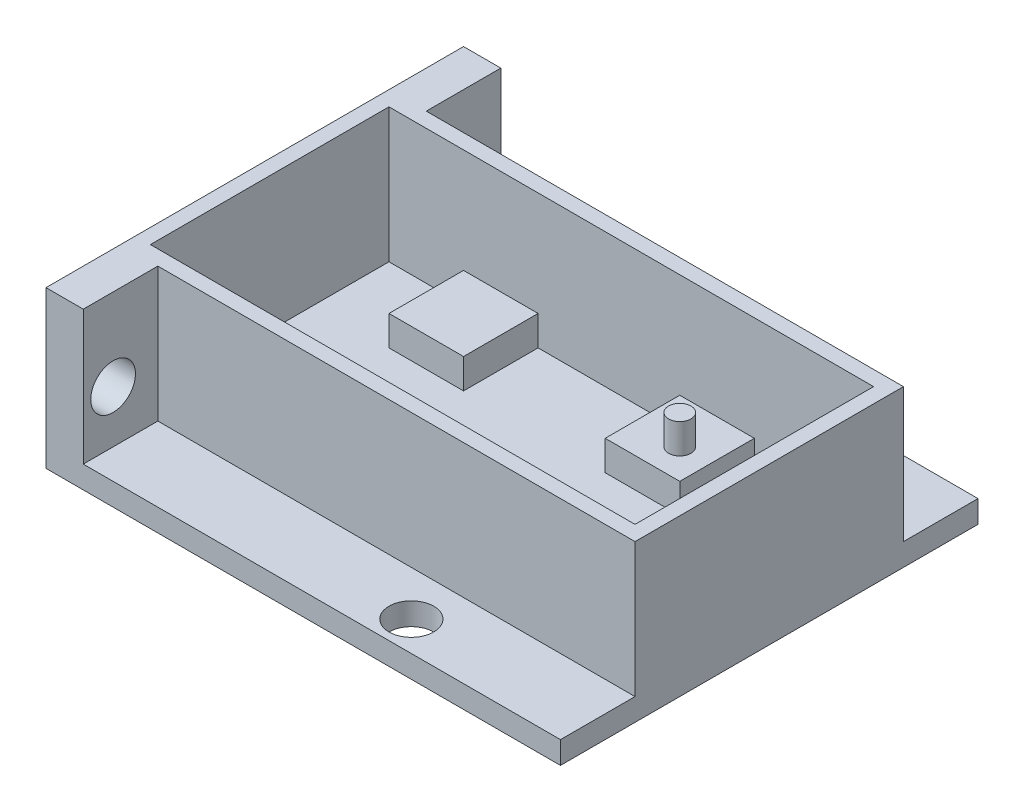
ISO-10303-21;
HEADER;
FILE_DESCRIPTION(('STEP AP214'),'2;1');
FILE_NAME('part.step','',(''),(''),'','','');
FILE_SCHEMA(('AUTOMOTIVE_DESIGN { 1 0 10303 214 1 1 1 1 }'));
ENDSEC;
DATA;
#1=APPLICATION_CONTEXT('core data for automotive mechanical design processes');
#2=APPLICATION_PROTOCOL_DEFINITION('international standard','automotive_design',2000,#1);
#3=PRODUCT_CONTEXT('',#1,'mechanical');
#4=PRODUCT('Part','Part','',(#3));
#5=PRODUCT_RELATED_PRODUCT_CATEGORY('part','',(#4));
#6=PRODUCT_DEFINITION_FORMATION('','',#4);
#7=PRODUCT_DEFINITION_CONTEXT('part definition',#1,'design');
#8=PRODUCT_DEFINITION('design','',#6,#7);
#9=PRODUCT_DEFINITION_SHAPE('','',#8);
#10=(LENGTH_UNIT() NAMED_UNIT(*) SI_UNIT(.MILLI.,.METRE.));
#11=(NAMED_UNIT(*) PLANE_ANGLE_UNIT() SI_UNIT($,.RADIAN.));
#12=(NAMED_UNIT(*) SI_UNIT($,.STERADIAN.) SOLID_ANGLE_UNIT());
#13=UNCERTAINTY_MEASURE_WITH_UNIT(LENGTH_MEASURE(1.E-05),#10,'distance_accuracy_value','');
#14=(GEOMETRIC_REPRESENTATION_CONTEXT(3) GLOBAL_UNCERTAINTY_ASSIGNED_CONTEXT((#13)) GLOBAL_UNIT_ASSIGNED_CONTEXT((#10,
#11,#12)) REPRESENTATION_CONTEXT('',''));
#15=CARTESIAN_POINT('',(0.,0.,0.));
#16=DIRECTION('',(0.,0.,1.));
#17=DIRECTION('',(1.,0.,0.));
#18=AXIS2_PLACEMENT_3D('',#15,#16,#17);
#19=CARTESIAN_POINT('',(-17.25,10.5,9.));
#20=DIRECTION('',(0.,0.,-1.));
#21=DIRECTION('',(-1.,0.,0.));
#22=AXIS2_PLACEMENT_3D('',#19,#20,#21);
#23=PLANE('',#22);
#24=DIRECTION('',(0.,-1.,0.));
#25=VECTOR('',#24,1.);
#26=CARTESIAN_POINT('',(-14.75,16.0901699437495,9.));
#27=LINE('',#26,#25);
#28=CARTESIAN_POINT('',(-14.75,10.5,9.));
#29=VERTEX_POINT('',#28);
#30=CARTESIAN_POINT('',(-14.75,1.5,9.));
#31=VERTEX_POINT('',#30);
#32=EDGE_CURVE('E234',#29,#31,#27,.T.);
#33=ORIENTED_EDGE('',*,*,#32,.T.);
#34=DIRECTION('',(-1.,0.,0.));
#35=VECTOR('',#34,1.);
#36=CARTESIAN_POINT('',(-17.25,1.5,9.));
#37=LINE('',#36,#35);
#38=CARTESIAN_POINT('',(17.25,1.5,9.));
#39=VERTEX_POINT('',#38);
#40=EDGE_CURVE('E458',#39,#31,#37,.T.);
#41=ORIENTED_EDGE('',*,*,#40,.F.);
#42=DIRECTION('',(0.,-1.,0.));
#43=VECTOR('',#42,1.);
#44=CARTESIAN_POINT('',(17.25,10.5,9.));
#45=LINE('',#44,#43);
#46=CARTESIAN_POINT('',(17.25,10.5,9.));
#47=VERTEX_POINT('',#46);
#48=EDGE_CURVE('E253',#47,#39,#45,.T.);
#49=ORIENTED_EDGE('',*,*,#48,.F.);
#50=DIRECTION('',(1.,0.,0.));
#51=VECTOR('',#50,1.);
#52=CARTESIAN_POINT('',(-17.25,10.5,9.));
#53=LINE('',#52,#51);
#54=EDGE_CURVE('E248',#29,#47,#53,.T.);
#55=ORIENTED_EDGE('',*,*,#54,.F.);
#56=EDGE_LOOP('',(#33,#41,#49,#55));
#57=FACE_BOUND('',#56,.T.);
#58=ADVANCED_FACE('F37',(#57),#23,.F.);
#59=CARTESIAN_POINT('',(0.,1.5,0.));
#60=DIRECTION('',(0.,1.,0.));
#61=DIRECTION('',(0.,0.,1.));
#62=AXIS2_PLACEMENT_3D('',#59,#60,#61);
#63=PLANE('',#62);
#64=CARTESIAN_POINT('',(5.25,1.5,12.));
#65=DIRECTION('',(0.,1.,0.));
#66=DIRECTION('',(0.,0.,-1.));
#67=AXIS2_PLACEMENT_3D('',#64,#65,#66);
#68=CIRCLE('',#67,1.5);
#69=CARTESIAN_POINT('',(5.25,1.5,10.5));
#70=VERTEX_POINT('',#69);
#71=EDGE_CURVE('E469',#70,#70,#68,.T.);
#72=ORIENTED_EDGE('',*,*,#71,.F.);
#73=EDGE_LOOP('',(#72));
#74=FACE_BOUND('',#73,.T.);
#75=ORIENTED_EDGE('',*,*,#40,.T.);
#76=DIRECTION('',(0.,0.,-1.));
#77=VECTOR('',#76,1.);
#78=CARTESIAN_POINT('',(-14.75,1.5,14.));
#79=LINE('',#78,#77);
#80=CARTESIAN_POINT('',(-14.75,1.5,14.));
#81=VERTEX_POINT('',#80);
#82=EDGE_CURVE('E238',#81,#31,#79,.T.);
#83=ORIENTED_EDGE('',*,*,#82,.F.);
#84=DIRECTION('',(1.,0.,0.));
#85=VECTOR('',#84,1.);
#86=CARTESIAN_POINT('',(-17.25,1.5,14.));
#87=LINE('',#86,#85);
#88=CARTESIAN_POINT('',(17.25,1.5,14.));
#89=VERTEX_POINT('',#88);
#90=EDGE_CURVE('E462',#81,#89,#87,.T.);
#91=ORIENTED_EDGE('',*,*,#90,.T.);
#92=DIRECTION('',(0.,0.,-1.));
#93=VECTOR('',#92,1.);
#94=CARTESIAN_POINT('',(17.25,1.5,9.));
#95=LINE('',#94,#93);
#96=EDGE_CURVE('E465',#89,#39,#95,.T.);
#97=ORIENTED_EDGE('',*,*,#96,.T.);
#98=EDGE_LOOP('',(#75,#83,#91,#97));
#99=FACE_BOUND('',#98,.T.);
#100=ADVANCED_FACE('F578',(#74,#99),#63,.T.);
#101=CARTESIAN_POINT('',(-17.25,10.5,-9.));
#102=DIRECTION('',(0.,0.,1.));
#103=DIRECTION('',(1.,0.,0.));
#104=AXIS2_PLACEMENT_3D('',#101,#102,#103);
#105=PLANE('',#104);
#106=DIRECTION('',(0.,-1.,0.));
#107=VECTOR('',#106,1.);
#108=CARTESIAN_POINT('',(-14.75,16.0901699437495,-9.));
#109=LINE('',#108,#107);
#110=CARTESIAN_POINT('',(-14.75,10.5,-9.));
#111=VERTEX_POINT('',#110);
#112=CARTESIAN_POINT('',(-14.75,1.5,-9.));
#113=VERTEX_POINT('',#112);
#114=EDGE_CURVE('E60',#111,#113,#109,.T.);
#115=ORIENTED_EDGE('',*,*,#114,.F.);
#116=DIRECTION('',(-1.,0.,0.));
#117=VECTOR('',#116,1.);
#118=CARTESIAN_POINT('',(-17.25,10.5,-9.));
#119=LINE('',#118,#117);
#120=CARTESIAN_POINT('',(17.25,10.5,-9.));
#121=VERTEX_POINT('',#120);
#122=EDGE_CURVE('E258',#121,#111,#119,.T.);
#123=ORIENTED_EDGE('',*,*,#122,.F.);
#124=DIRECTION('',(0.,-1.,0.));
#125=VECTOR('',#124,1.);
#126=CARTESIAN_POINT('',(17.25,10.5,-9.));
#127=LINE('',#126,#125);
#128=CARTESIAN_POINT('',(17.25,1.5,-9.));
#129=VERTEX_POINT('',#128);
#130=EDGE_CURVE('E265',#121,#129,#127,.T.);
#131=ORIENTED_EDGE('',*,*,#130,.T.);
#132=DIRECTION('',(1.,0.,0.));
#133=VECTOR('',#132,1.);
#134=CARTESIAN_POINT('',(-17.25,1.5,-9.));
#135=LINE('',#134,#133);
#136=EDGE_CURVE('E447',#113,#129,#135,.T.);
#137=ORIENTED_EDGE('',*,*,#136,.F.);
#138=EDGE_LOOP('',(#115,#123,#131,#137));
#139=FACE_BOUND('',#138,.T.);
#140=ADVANCED_FACE('F583',(#139),#105,.F.);
#141=CARTESIAN_POINT('',(0.,1.5,0.));
#142=DIRECTION('',(0.,-1.,0.));
#143=DIRECTION('',(0.,0.,-1.));
#144=AXIS2_PLACEMENT_3D('',#141,#142,#143);
#145=PLANE('',#144);
#146=CARTESIAN_POINT('',(5.25,1.5,-12.));
#147=DIRECTION('',(0.,1.,0.));
#148=DIRECTION('',(0.,0.,1.));
#149=AXIS2_PLACEMENT_3D('',#146,#147,#148);
#150=CIRCLE('',#149,1.5);
#151=CARTESIAN_POINT('',(5.25,1.5,-10.5));
#152=VERTEX_POINT('',#151);
#153=EDGE_CURVE('E476',#152,#152,#150,.T.);
#154=ORIENTED_EDGE('',*,*,#153,.F.);
#155=EDGE_LOOP('',(#154));
#156=FACE_BOUND('',#155,.T.);
#157=DIRECTION('',(0.,0.,-1.));
#158=VECTOR('',#157,1.);
#159=CARTESIAN_POINT('',(-14.75,1.5,-14.));
#160=LINE('',#159,#158);
#161=CARTESIAN_POINT('',(-14.75,1.5,-14.));
#162=VERTEX_POINT('',#161);
#163=EDGE_CURVE('E485',#113,#162,#160,.T.);
#164=ORIENTED_EDGE('',*,*,#163,.F.);
#165=ORIENTED_EDGE('',*,*,#136,.T.);
#166=DIRECTION('',(0.,0.,-1.));
#167=VECTOR('',#166,1.);
#168=CARTESIAN_POINT('',(17.25,1.5,-9.));
#169=LINE('',#168,#167);
#170=CARTESIAN_POINT('',(17.25,1.5,-14.));
#171=VERTEX_POINT('',#170);
#172=EDGE_CURVE('E450',#129,#171,#169,.T.);
#173=ORIENTED_EDGE('',*,*,#172,.T.);
#174=DIRECTION('',(-1.,0.,0.));
#175=VECTOR('',#174,1.);
#176=CARTESIAN_POINT('',(-17.25,1.5,-14.));
#177=LINE('',#176,#175);
#178=EDGE_CURVE('E443',#171,#162,#177,.T.);
#179=ORIENTED_EDGE('',*,*,#178,.T.);
#180=EDGE_LOOP('',(#164,#165,#173,#179));
#181=FACE_BOUND('',#180,.T.);
#182=ADVANCED_FACE('F594',(#156,#181),#145,.F.);
#183=CARTESIAN_POINT('',(0.,1.5,0.));
#184=DIRECTION('',(0.,1.,0.));
#185=DIRECTION('',(0.,0.,1.));
#186=AXIS2_PLACEMENT_3D('',#183,#184,#185);
#187=PLANE('',#186);
#188=DIRECTION('',(1.,0.,0.));
#189=VECTOR('',#188,1.);
#190=CARTESIAN_POINT('',(-16.25,1.5,8.));
#191=LINE('',#190,#189);
#192=CARTESIAN_POINT('',(-16.25,1.5,8.));
#193=VERTEX_POINT('',#192);
#194=CARTESIAN_POINT('',(-11.25,1.5,8.));
#195=VERTEX_POINT('',#194);
#196=EDGE_CURVE('E277',#193,#195,#191,.T.);
#197=ORIENTED_EDGE('',*,*,#196,.T.);
#198=DIRECTION('',(0.,0.,1.));
#199=VECTOR('',#198,1.);
#200=CARTESIAN_POINT('',(-11.25,1.5,8.));
#201=LINE('',#200,#199);
#202=CARTESIAN_POINT('',(-11.25,1.5,3.));
#203=VERTEX_POINT('',#202);
#204=EDGE_CURVE('E428',#203,#195,#201,.T.);
#205=ORIENTED_EDGE('',*,*,#204,.F.);
#206=DIRECTION('',(-1.,0.,0.));
#207=VECTOR('',#206,1.);
#208=CARTESIAN_POINT('',(-11.25,1.5,3.));
#209=LINE('',#208,#207);
#210=CARTESIAN_POINT('',(-6.25,1.5,3.));
#211=VERTEX_POINT('',#210);
#212=EDGE_CURVE('E423',#211,#203,#209,.T.);
#213=ORIENTED_EDGE('',*,*,#212,.F.);
#214=DIRECTION('',(0.,0.,-1.));
#215=VECTOR('',#214,1.);
#216=CARTESIAN_POINT('',(-6.25,1.5,8.));
#217=LINE('',#216,#215);
#218=CARTESIAN_POINT('',(-6.25,1.5,8.));
#219=VERTEX_POINT('',#218);
#220=EDGE_CURVE('E426',#219,#211,#217,.T.);
#221=ORIENTED_EDGE('',*,*,#220,.F.);
#222=CARTESIAN_POINT('',(3.25000000000001,1.5,8.));
#223=VERTEX_POINT('',#222);
#224=EDGE_CURVE('E281',#219,#223,#191,.T.);
#225=ORIENTED_EDGE('',*,*,#224,.T.);
#226=DIRECTION('',(0.,0.,1.));
#227=VECTOR('',#226,1.);
#228=CARTESIAN_POINT('',(3.25000000000001,1.5,8.));
#229=LINE('',#228,#227);
#230=CARTESIAN_POINT('',(3.25000000000001,1.5,3.));
#231=VERTEX_POINT('',#230);
#232=EDGE_CURVE('E364',#231,#223,#229,.T.);
#233=ORIENTED_EDGE('',*,*,#232,.F.);
#234=DIRECTION('',(-1.,0.,0.));
#235=VECTOR('',#234,1.);
#236=CARTESIAN_POINT('',(8.25000000000001,1.5,3.));
#237=LINE('',#236,#235);
#238=CARTESIAN_POINT('',(8.25000000000001,1.5,3.));
#239=VERTEX_POINT('',#238);
#240=EDGE_CURVE('E368',#239,#231,#237,.T.);
#241=ORIENTED_EDGE('',*,*,#240,.F.);
#242=DIRECTION('',(0.,0.,-1.));
#243=VECTOR('',#242,1.);
#244=CARTESIAN_POINT('',(8.25000000000001,1.5,8.));
#245=LINE('',#244,#243);
#246=CARTESIAN_POINT('',(8.25,1.5,8.));
#247=VERTEX_POINT('',#246);
#248=EDGE_CURVE('E371',#247,#239,#245,.T.);
#249=ORIENTED_EDGE('',*,*,#248,.F.);
#250=CARTESIAN_POINT('',(16.25,1.5,8.));
#251=VERTEX_POINT('',#250);
#252=EDGE_CURVE('E276',#247,#251,#191,.T.);
#253=ORIENTED_EDGE('',*,*,#252,.T.);
#254=DIRECTION('',(0.,0.,-1.));
#255=VECTOR('',#254,1.);
#256=CARTESIAN_POINT('',(16.25,1.5,-8.));
#257=LINE('',#256,#255);
#258=CARTESIAN_POINT('',(16.25,1.5,-8.));
#259=VERTEX_POINT('',#258);
#260=EDGE_CURVE('E280',#251,#259,#257,.T.);
#261=ORIENTED_EDGE('',*,*,#260,.T.);
#262=DIRECTION('',(-1.,0.,0.));
#263=VECTOR('',#262,1.);
#264=CARTESIAN_POINT('',(-16.25,1.5,-8.));
#265=LINE('',#264,#263);
#266=CARTESIAN_POINT('',(8.25,1.5,-8.));
#267=VERTEX_POINT('',#266);
#268=EDGE_CURVE('E45',#259,#267,#265,.T.);
#269=ORIENTED_EDGE('',*,*,#268,.T.);
#270=DIRECTION('',(0.,0.,-1.));
#271=VECTOR('',#270,1.);
#272=CARTESIAN_POINT('',(8.25,1.5,-8.));
#273=LINE('',#272,#271);
#274=CARTESIAN_POINT('',(8.25,1.5,-3.));
#275=VERTEX_POINT('',#274);
#276=EDGE_CURVE('E342',#275,#267,#273,.T.);
#277=ORIENTED_EDGE('',*,*,#276,.F.);
#278=DIRECTION('',(1.,0.,0.));
#279=VECTOR('',#278,1.);
#280=CARTESIAN_POINT('',(8.25,1.5,-3.));
#281=LINE('',#280,#279);
#282=CARTESIAN_POINT('',(3.25,1.5,-3.));
#283=VERTEX_POINT('',#282);
#284=EDGE_CURVE('E337',#283,#275,#281,.T.);
#285=ORIENTED_EDGE('',*,*,#284,.F.);
#286=DIRECTION('',(0.,0.,1.));
#287=VECTOR('',#286,1.);
#288=CARTESIAN_POINT('',(3.25,1.5,-8.));
#289=LINE('',#288,#287);
#290=CARTESIAN_POINT('',(3.25,1.5,-8.));
#291=VERTEX_POINT('',#290);
#292=EDGE_CURVE('E340',#291,#283,#289,.T.);
#293=ORIENTED_EDGE('',*,*,#292,.F.);
#294=CARTESIAN_POINT('',(-6.25,1.5,-8.));
#295=VERTEX_POINT('',#294);
#296=EDGE_CURVE('E285',#291,#295,#265,.T.);
#297=ORIENTED_EDGE('',*,*,#296,.T.);
#298=DIRECTION('',(0.,0.,-1.));
#299=VECTOR('',#298,1.);
#300=CARTESIAN_POINT('',(-6.25,1.5,-8.));
#301=LINE('',#300,#299);
#302=CARTESIAN_POINT('',(-6.25,1.5,-3.));
#303=VERTEX_POINT('',#302);
#304=EDGE_CURVE('E394',#303,#295,#301,.T.);
#305=ORIENTED_EDGE('',*,*,#304,.F.);
#306=DIRECTION('',(1.,0.,0.));
#307=VECTOR('',#306,1.);
#308=CARTESIAN_POINT('',(-11.25,1.5,-3.));
#309=LINE('',#308,#307);
#310=CARTESIAN_POINT('',(-11.25,1.5,-3.));
#311=VERTEX_POINT('',#310);
#312=EDGE_CURVE('E398',#311,#303,#309,.T.);
#313=ORIENTED_EDGE('',*,*,#312,.F.);
#314=DIRECTION('',(0.,0.,1.));
#315=VECTOR('',#314,1.);
#316=CARTESIAN_POINT('',(-11.25,1.5,-8.));
#317=LINE('',#316,#315);
#318=CARTESIAN_POINT('',(-11.25,1.5,-8.));
#319=VERTEX_POINT('',#318);
#320=EDGE_CURVE('E294',#319,#311,#317,.T.);
#321=ORIENTED_EDGE('',*,*,#320,.F.);
#322=CARTESIAN_POINT('',(-16.25,1.5,-8.));
#323=VERTEX_POINT('',#322);
#324=EDGE_CURVE('E283',#319,#323,#265,.T.);
#325=ORIENTED_EDGE('',*,*,#324,.T.);
#326=DIRECTION('',(0.,0.,1.));
#327=VECTOR('',#326,1.);
#328=CARTESIAN_POINT('',(-16.25,1.5,-8.));
#329=LINE('',#328,#327);
#330=EDGE_CURVE('E273',#323,#193,#329,.T.);
#331=ORIENTED_EDGE('',*,*,#330,.T.);
#332=EDGE_LOOP('',(#197,#205,#213,#221,#225,#233,#241,#249,#253,#261,#269,#277,#285,#293,#297,
#305,#313,#321,#325,#331));
#333=FACE_BOUND('',#332,.T.);
#334=ADVANCED_FACE('F291',(#333),#187,.T.);
#335=CARTESIAN_POINT('',(-16.25,10.5,8.));
#336=DIRECTION('',(0.,0.,-1.));
#337=DIRECTION('',(-1.,0.,0.));
#338=AXIS2_PLACEMENT_3D('',#335,#336,#337);
#339=PLANE('',#338);
#340=DIRECTION('',(1.,0.,0.));
#341=VECTOR('',#340,1.);
#342=CARTESIAN_POINT('',(-11.25,3.5,8.));
#343=LINE('',#342,#341);
#344=CARTESIAN_POINT('',(-11.25,3.5,8.));
#345=VERTEX_POINT('',#344);
#346=CARTESIAN_POINT('',(-6.25,3.5,8.));
#347=VERTEX_POINT('',#346);
#348=EDGE_CURVE('E434',#345,#347,#343,.T.);
#349=ORIENTED_EDGE('',*,*,#348,.F.);
#350=DIRECTION('',(0.,-1.,0.));
#351=VECTOR('',#350,1.);
#352=CARTESIAN_POINT('',(-11.25,3.5,8.));
#353=LINE('',#352,#351);
#354=EDGE_CURVE('E402',#345,#195,#353,.T.);
#355=ORIENTED_EDGE('',*,*,#354,.T.);
#356=ORIENTED_EDGE('',*,*,#196,.F.);
#357=DIRECTION('',(0.,-1.,0.));
#358=VECTOR('',#357,1.);
#359=CARTESIAN_POINT('',(-16.25,10.5,8.));
#360=LINE('',#359,#358);
#361=CARTESIAN_POINT('',(-16.25,10.5,8.));
#362=VERTEX_POINT('',#361);
#363=EDGE_CURVE('E268',#362,#193,#360,.T.);
#364=ORIENTED_EDGE('',*,*,#363,.F.);
#365=DIRECTION('',(1.,0.,0.));
#366=VECTOR('',#365,1.);
#367=CARTESIAN_POINT('',(-16.25,10.5,8.));
#368=LINE('',#367,#366);
#369=CARTESIAN_POINT('',(16.25,10.5,8.));
#370=VERTEX_POINT('',#369);
#371=EDGE_CURVE('E322',#362,#370,#368,.T.);
#372=ORIENTED_EDGE('',*,*,#371,.T.);
#373=DIRECTION('',(0.,-1.,0.));
#374=VECTOR('',#373,1.);
#375=CARTESIAN_POINT('',(16.25,10.5,8.));
#376=LINE('',#375,#374);
#377=EDGE_CURVE('E312',#370,#251,#376,.T.);
#378=ORIENTED_EDGE('',*,*,#377,.T.);
#379=ORIENTED_EDGE('',*,*,#252,.F.);
#380=DIRECTION('',(0.,-1.,0.));
#381=VECTOR('',#380,1.);
#382=CARTESIAN_POINT('',(8.25000000000001,3.5,8.));
#383=LINE('',#382,#381);
#384=CARTESIAN_POINT('',(8.25000000000001,3.5,8.));
#385=VERTEX_POINT('',#384);
#386=EDGE_CURVE('E360',#385,#247,#383,.T.);
#387=ORIENTED_EDGE('',*,*,#386,.F.);
#388=DIRECTION('',(1.,0.,0.));
#389=VECTOR('',#388,1.);
#390=CARTESIAN_POINT('',(8.25000000000001,3.5,8.));
#391=LINE('',#390,#389);
#392=CARTESIAN_POINT('',(3.25000000000001,3.5,8.));
#393=VERTEX_POINT('',#392);
#394=EDGE_CURVE('E363',#393,#385,#391,.T.);
#395=ORIENTED_EDGE('',*,*,#394,.F.);
#396=DIRECTION('',(0.,-1.,0.));
#397=VECTOR('',#396,1.);
#398=CARTESIAN_POINT('',(3.25000000000001,3.5,8.));
#399=LINE('',#398,#397);
#400=EDGE_CURVE('E357',#393,#223,#399,.T.);
#401=ORIENTED_EDGE('',*,*,#400,.T.);
#402=ORIENTED_EDGE('',*,*,#224,.F.);
#403=DIRECTION('',(0.,-1.,0.));
#404=VECTOR('',#403,1.);
#405=CARTESIAN_POINT('',(-6.25,3.5,8.));
#406=LINE('',#405,#404);
#407=EDGE_CURVE('E414',#347,#219,#406,.T.);
#408=ORIENTED_EDGE('',*,*,#407,.F.);
#409=EDGE_LOOP('',(#349,#355,#356,#364,#372,#378,#379,#387,#395,#401,#402,#408));
#410=FACE_BOUND('',#409,.T.);
#411=ADVANCED_FACE('F545',(#410),#339,.T.);
#412=CARTESIAN_POINT('',(-16.25,10.5,-8.));
#413=DIRECTION('',(0.,0.,1.));
#414=DIRECTION('',(1.,0.,0.));
#415=AXIS2_PLACEMENT_3D('',#412,#413,#414);
#416=PLANE('',#415);
#417=ORIENTED_EDGE('',*,*,#324,.F.);
#418=DIRECTION('',(0.,-1.,0.));
#419=VECTOR('',#418,1.);
#420=CARTESIAN_POINT('',(-11.25,3.5,-8.));
#421=LINE('',#420,#419);
#422=CARTESIAN_POINT('',(-11.25,3.5,-8.));
#423=VERTEX_POINT('',#422);
#424=EDGE_CURVE('E391',#423,#319,#421,.T.);
#425=ORIENTED_EDGE('',*,*,#424,.F.);
#426=DIRECTION('',(-1.,0.,0.));
#427=VECTOR('',#426,1.);
#428=CARTESIAN_POINT('',(-11.25,3.5,-8.));
#429=LINE('',#428,#427);
#430=CARTESIAN_POINT('',(-6.25,3.5,-8.));
#431=VERTEX_POINT('',#430);
#432=EDGE_CURVE('E393',#431,#423,#429,.T.);
#433=ORIENTED_EDGE('',*,*,#432,.F.);
#434=DIRECTION('',(0.,-1.,0.));
#435=VECTOR('',#434,1.);
#436=CARTESIAN_POINT('',(-6.25,3.5,-8.));
#437=LINE('',#436,#435);
#438=EDGE_CURVE('E389',#431,#295,#437,.T.);
#439=ORIENTED_EDGE('',*,*,#438,.T.);
#440=ORIENTED_EDGE('',*,*,#296,.F.);
#441=DIRECTION('',(0.,-1.,0.));
#442=VECTOR('',#441,1.);
#443=CARTESIAN_POINT('',(3.25,3.5,-8.));
#444=LINE('',#443,#442);
#445=CARTESIAN_POINT('',(3.25,3.5,-8.));
#446=VERTEX_POINT('',#445);
#447=EDGE_CURVE('E328',#446,#291,#444,.T.);
#448=ORIENTED_EDGE('',*,*,#447,.F.);
#449=DIRECTION('',(-1.,0.,0.));
#450=VECTOR('',#449,1.);
#451=CARTESIAN_POINT('',(8.25,3.5,-8.));
#452=LINE('',#451,#450);
#453=CARTESIAN_POINT('',(8.25,3.5,-8.));
#454=VERTEX_POINT('',#453);
#455=EDGE_CURVE('E348',#454,#446,#452,.T.);
#456=ORIENTED_EDGE('',*,*,#455,.F.);
#457=DIRECTION('',(0.,-1.,0.));
#458=VECTOR('',#457,1.);
#459=CARTESIAN_POINT('',(8.25,3.5,-8.));
#460=LINE('',#459,#458);
#461=EDGE_CURVE('E325',#454,#267,#460,.T.);
#462=ORIENTED_EDGE('',*,*,#461,.T.);
#463=ORIENTED_EDGE('',*,*,#268,.F.);
#464=DIRECTION('',(0.,-1.,0.));
#465=VECTOR('',#464,1.);
#466=CARTESIAN_POINT('',(16.25,10.5,-8.));
#467=LINE('',#466,#465);
#468=CARTESIAN_POINT('',(16.25,10.5,-8.));
#469=VERTEX_POINT('',#468);
#470=EDGE_CURVE('E304',#469,#259,#467,.T.);
#471=ORIENTED_EDGE('',*,*,#470,.F.);
#472=DIRECTION('',(-1.,0.,0.));
#473=VECTOR('',#472,1.);
#474=CARTESIAN_POINT('',(-16.25,10.5,-8.));
#475=LINE('',#474,#473);
#476=CARTESIAN_POINT('',(-16.25,10.5,-8.));
#477=VERTEX_POINT('',#476);
#478=EDGE_CURVE('E301',#469,#477,#475,.T.);
#479=ORIENTED_EDGE('',*,*,#478,.T.);
#480=DIRECTION('',(0.,-1.,0.));
#481=VECTOR('',#480,1.);
#482=CARTESIAN_POINT('',(-16.25,10.5,-8.));
#483=LINE('',#482,#481);
#484=EDGE_CURVE('E298',#477,#323,#483,.T.);
#485=ORIENTED_EDGE('',*,*,#484,.T.);
#486=EDGE_LOOP('',(#417,#425,#433,#439,#440,#448,#456,#462,#463,#471,#479,#485));
#487=FACE_BOUND('',#486,.T.);
#488=ADVANCED_FACE('F299',(#487),#416,.T.);
#489=CARTESIAN_POINT('',(0.,10.5,0.));
#490=DIRECTION('',(0.,1.,0.));
#491=DIRECTION('',(0.,0.,1.));
#492=AXIS2_PLACEMENT_3D('',#489,#490,#491);
#493=PLANE('',#492);
#494=DIRECTION('',(0.,0.,1.));
#495=VECTOR('',#494,1.);
#496=CARTESIAN_POINT('',(-17.25,10.5,-9.));
#497=LINE('',#496,#495);
#498=CARTESIAN_POINT('',(-17.25,10.5,-14.));
#499=VERTEX_POINT('',#498);
#500=CARTESIAN_POINT('',(-17.25,10.5,14.));
#501=VERTEX_POINT('',#500);
#502=EDGE_CURVE('E256',#499,#501,#497,.T.);
#503=ORIENTED_EDGE('',*,*,#502,.T.);
#504=DIRECTION('',(1.,0.,0.));
#505=VECTOR('',#504,1.);
#506=CARTESIAN_POINT('',(-17.25,10.5,14.));
#507=LINE('',#506,#505);
#508=CARTESIAN_POINT('',(-14.75,10.5,14.));
#509=VERTEX_POINT('',#508);
#510=EDGE_CURVE('E242',#501,#509,#507,.T.);
#511=ORIENTED_EDGE('',*,*,#510,.T.);
#512=DIRECTION('',(0.,0.,-1.));
#513=VECTOR('',#512,1.);
#514=CARTESIAN_POINT('',(-14.75,10.5,14.));
#515=LINE('',#514,#513);
#516=EDGE_CURVE('E237',#509,#29,#515,.T.);
#517=ORIENTED_EDGE('',*,*,#516,.T.);
#518=ORIENTED_EDGE('',*,*,#54,.T.);
#519=DIRECTION('',(0.,0.,-1.));
#520=VECTOR('',#519,1.);
#521=CARTESIAN_POINT('',(17.25,10.5,-9.));
#522=LINE('',#521,#520);
#523=EDGE_CURVE('E255',#47,#121,#522,.T.);
#524=ORIENTED_EDGE('',*,*,#523,.T.);
#525=ORIENTED_EDGE('',*,*,#122,.T.);
#526=DIRECTION('',(0.,0.,-1.));
#527=VECTOR('',#526,1.);
#528=CARTESIAN_POINT('',(-14.75,10.5,-14.));
#529=LINE('',#528,#527);
#530=CARTESIAN_POINT('',(-14.75,10.5,-14.));
#531=VERTEX_POINT('',#530);
#532=EDGE_CURVE('E473',#111,#531,#529,.T.);
#533=ORIENTED_EDGE('',*,*,#532,.T.);
#534=DIRECTION('',(-1.,0.,0.));
#535=VECTOR('',#534,1.);
#536=CARTESIAN_POINT('',(-17.25,10.5,-14.));
#537=LINE('',#536,#535);
#538=EDGE_CURVE('E484',#531,#499,#537,.T.);
#539=ORIENTED_EDGE('',*,*,#538,.T.);
#540=EDGE_LOOP('',(#503,#511,#517,#518,#524,#525,#533,#539));
#541=FACE_BOUND('',#540,.T.);
#542=ORIENTED_EDGE('',*,*,#371,.F.);
#543=DIRECTION('',(0.,0.,1.));
#544=VECTOR('',#543,1.);
#545=CARTESIAN_POINT('',(-16.25,10.5,-8.));
#546=LINE('',#545,#544);
#547=EDGE_CURVE('E309',#477,#362,#546,.T.);
#548=ORIENTED_EDGE('',*,*,#547,.F.);
#549=ORIENTED_EDGE('',*,*,#478,.F.);
#550=DIRECTION('',(0.,0.,-1.));
#551=VECTOR('',#550,1.);
#552=CARTESIAN_POINT('',(16.25,10.5,-8.));
#553=LINE('',#552,#551);
#554=EDGE_CURVE('E319',#370,#469,#553,.T.);
#555=ORIENTED_EDGE('',*,*,#554,.F.);
#556=EDGE_LOOP('',(#542,#548,#549,#555));
#557=FACE_BOUND('',#556,.T.);
#558=ADVANCED_FACE('F246',(#541,#557),#493,.T.);
#559=CARTESIAN_POINT('',(-17.25,10.5,-9.));
#560=DIRECTION('',(1.,0.,0.));
#561=DIRECTION('',(0.,0.,-1.));
#562=AXIS2_PLACEMENT_3D('',#559,#560,#561);
#563=PLANE('',#562);
#564=CARTESIAN_POINT('',(-17.25,5.,-12.));
#565=DIRECTION('',(1.,0.,0.));
#566=DIRECTION('',(0.,0.,-1.));
#567=AXIS2_PLACEMENT_3D('',#564,#565,#566);
#568=CIRCLE('',#567,1.5);
#569=CARTESIAN_POINT('',(-17.25,5.,-13.5));
#570=VERTEX_POINT('',#569);
#571=EDGE_CURVE('E494',#570,#570,#568,.T.);
#572=ORIENTED_EDGE('',*,*,#571,.T.);
#573=EDGE_LOOP('',(#572));
#574=FACE_BOUND('',#573,.T.);
#575=CARTESIAN_POINT('',(-17.25,5.,12.));
#576=DIRECTION('',(1.,0.,0.));
#577=DIRECTION('',(0.,0.,1.));
#578=AXIS2_PLACEMENT_3D('',#575,#576,#577);
#579=CIRCLE('',#578,1.5);
#580=CARTESIAN_POINT('',(-17.25,5.,13.5));
#581=VERTEX_POINT('',#580);
#582=EDGE_CURVE('E500',#581,#581,#579,.T.);
#583=ORIENTED_EDGE('',*,*,#582,.T.);
#584=EDGE_LOOP('',(#583));
#585=FACE_BOUND('',#584,.T.);
#586=DIRECTION('',(0.,0.,1.));
#587=VECTOR('',#586,1.);
#588=CARTESIAN_POINT('',(-17.25,0.,-9.));
#589=LINE('',#588,#587);
#590=CARTESIAN_POINT('',(-17.25,0.,-14.));
#591=VERTEX_POINT('',#590);
#592=CARTESIAN_POINT('',(-17.25,0.,14.));
#593=VERTEX_POINT('',#592);
#594=EDGE_CURVE('E266',#591,#593,#589,.T.);
#595=ORIENTED_EDGE('',*,*,#594,.T.);
#596=DIRECTION('',(0.,-1.,0.));
#597=VECTOR('',#596,1.);
#598=CARTESIAN_POINT('',(-17.25,1.5,14.));
#599=LINE('',#598,#597);
#600=EDGE_CURVE('E448',#501,#593,#599,.T.);
#601=ORIENTED_EDGE('',*,*,#600,.F.);
#602=ORIENTED_EDGE('',*,*,#502,.F.);
#603=DIRECTION('',(0.,-1.,0.));
#604=VECTOR('',#603,1.);
#605=CARTESIAN_POINT('',(-17.25,1.5,-14.));
#606=LINE('',#605,#604);
#607=EDGE_CURVE('E440',#499,#591,#606,.T.);
#608=ORIENTED_EDGE('',*,*,#607,.T.);
#609=EDGE_LOOP('',(#595,#601,#602,#608));
#610=FACE_BOUND('',#609,.T.);
#611=ADVANCED_FACE('F590',(#574,#585,#610),#563,.F.);
#612=CARTESIAN_POINT('',(17.25,10.5,-9.));
#613=DIRECTION('',(-1.,0.,0.));
#614=DIRECTION('',(0.,0.,1.));
#615=AXIS2_PLACEMENT_3D('',#612,#613,#614);
#616=PLANE('',#615);
#617=DIRECTION('',(0.,0.,-1.));
#618=VECTOR('',#617,1.);
#619=CARTESIAN_POINT('',(17.25,0.,-9.));
#620=LINE('',#619,#618);
#621=CARTESIAN_POINT('',(17.25,0.,14.));
#622=VERTEX_POINT('',#621);
#623=CARTESIAN_POINT('',(17.25,0.,-14.));
#624=VERTEX_POINT('',#623);
#625=EDGE_CURVE('E260',#622,#624,#620,.T.);
#626=ORIENTED_EDGE('',*,*,#625,.T.);
#627=DIRECTION('',(0.,-1.,0.));
#628=VECTOR('',#627,1.);
#629=CARTESIAN_POINT('',(17.25,1.5,-14.));
#630=LINE('',#629,#628);
#631=EDGE_CURVE('E430',#171,#624,#630,.T.);
#632=ORIENTED_EDGE('',*,*,#631,.F.);
#633=ORIENTED_EDGE('',*,*,#172,.F.);
#634=ORIENTED_EDGE('',*,*,#130,.F.);
#635=ORIENTED_EDGE('',*,*,#523,.F.);
#636=ORIENTED_EDGE('',*,*,#48,.T.);
#637=ORIENTED_EDGE('',*,*,#96,.F.);
#638=DIRECTION('',(0.,-1.,0.));
#639=VECTOR('',#638,1.);
#640=CARTESIAN_POINT('',(17.25,1.5,14.));
#641=LINE('',#640,#639);
#642=EDGE_CURVE('E455',#89,#622,#641,.T.);
#643=ORIENTED_EDGE('',*,*,#642,.T.);
#644=EDGE_LOOP('',(#626,#632,#633,#634,#635,#636,#637,#643));
#645=FACE_BOUND('',#644,.T.);
#646=ADVANCED_FACE('F588',(#645),#616,.F.);
#647=CARTESIAN_POINT('',(-16.25,10.5,-8.));
#648=DIRECTION('',(1.,0.,0.));
#649=DIRECTION('',(0.,0.,-1.));
#650=AXIS2_PLACEMENT_3D('',#647,#648,#649);
#651=PLANE('',#650);
#652=ORIENTED_EDGE('',*,*,#363,.T.);
#653=ORIENTED_EDGE('',*,*,#330,.F.);
#654=ORIENTED_EDGE('',*,*,#484,.F.);
#655=ORIENTED_EDGE('',*,*,#547,.T.);
#656=EDGE_LOOP('',(#652,#653,#654,#655));
#657=FACE_BOUND('',#656,.T.);
#658=ADVANCED_FACE('F307',(#657),#651,.T.);
#659=CARTESIAN_POINT('',(16.25,10.5,-8.));
#660=DIRECTION('',(-1.,0.,0.));
#661=DIRECTION('',(0.,0.,1.));
#662=AXIS2_PLACEMENT_3D('',#659,#660,#661);
#663=PLANE('',#662);
#664=ORIENTED_EDGE('',*,*,#470,.T.);
#665=ORIENTED_EDGE('',*,*,#260,.F.);
#666=ORIENTED_EDGE('',*,*,#377,.F.);
#667=ORIENTED_EDGE('',*,*,#554,.T.);
#668=EDGE_LOOP('',(#664,#665,#666,#667));
#669=FACE_BOUND('',#668,.T.);
#670=ADVANCED_FACE('F764',(#669),#663,.T.);
#671=CARTESIAN_POINT('',(0.,0.,0.));
#672=DIRECTION('',(0.,1.,0.));
#673=DIRECTION('',(0.,0.,1.));
#674=AXIS2_PLACEMENT_3D('',#671,#672,#673);
#675=PLANE('',#674);
#676=CARTESIAN_POINT('',(5.25,0.,-12.));
#677=DIRECTION('',(0.,1.,0.));
#678=DIRECTION('',(0.,0.,1.));
#679=AXIS2_PLACEMENT_3D('',#676,#677,#678);
#680=CIRCLE('',#679,1.5);
#681=CARTESIAN_POINT('',(5.25,0.,-10.5));
#682=VERTEX_POINT('',#681);
#683=EDGE_CURVE('E463',#682,#682,#680,.T.);
#684=ORIENTED_EDGE('',*,*,#683,.T.);
#685=EDGE_LOOP('',(#684));
#686=FACE_BOUND('',#685,.T.);
#687=CARTESIAN_POINT('',(5.25,0.,12.));
#688=DIRECTION('',(0.,1.,0.));
#689=DIRECTION('',(0.,0.,-1.));
#690=AXIS2_PLACEMENT_3D('',#687,#688,#689);
#691=CIRCLE('',#690,1.5);
#692=CARTESIAN_POINT('',(5.25,0.,10.5));
#693=VERTEX_POINT('',#692);
#694=EDGE_CURVE('E472',#693,#693,#691,.T.);
#695=ORIENTED_EDGE('',*,*,#694,.T.);
#696=EDGE_LOOP('',(#695));
#697=FACE_BOUND('',#696,.T.);
#698=ORIENTED_EDGE('',*,*,#594,.F.);
#699=DIRECTION('',(-1.,0.,0.));
#700=VECTOR('',#699,1.);
#701=CARTESIAN_POINT('',(-17.25,0.,-14.));
#702=LINE('',#701,#700);
#703=EDGE_CURVE('E444',#624,#591,#702,.T.);
#704=ORIENTED_EDGE('',*,*,#703,.F.);
#705=ORIENTED_EDGE('',*,*,#625,.F.);
#706=DIRECTION('',(1.,0.,0.));
#707=VECTOR('',#706,1.);
#708=CARTESIAN_POINT('',(-17.25,0.,14.));
#709=LINE('',#708,#707);
#710=EDGE_CURVE('E459',#593,#622,#709,.T.);
#711=ORIENTED_EDGE('',*,*,#710,.F.);
#712=EDGE_LOOP('',(#698,#704,#705,#711));
#713=FACE_BOUND('',#712,.T.);
#714=ADVANCED_FACE('F39',(#686,#697,#713),#675,.F.);
#715=CARTESIAN_POINT('',(8.25,3.5,-8.));
#716=DIRECTION('',(-1.,0.,0.));
#717=DIRECTION('',(0.,0.,1.));
#718=AXIS2_PLACEMENT_3D('',#715,#716,#717);
#719=PLANE('',#718);
#720=ORIENTED_EDGE('',*,*,#276,.T.);
#721=ORIENTED_EDGE('',*,*,#461,.F.);
#722=DIRECTION('',(0.,0.,-1.));
#723=VECTOR('',#722,1.);
#724=CARTESIAN_POINT('',(8.25,3.5,-8.));
#725=LINE('',#724,#723);
#726=CARTESIAN_POINT('',(8.25,3.5,-3.));
#727=VERTEX_POINT('',#726);
#728=EDGE_CURVE('E339',#727,#454,#725,.T.);
#729=ORIENTED_EDGE('',*,*,#728,.F.);
#730=DIRECTION('',(0.,-1.,0.));
#731=VECTOR('',#730,1.);
#732=CARTESIAN_POINT('',(8.25,3.5,-3.));
#733=LINE('',#732,#731);
#734=EDGE_CURVE('E333',#727,#275,#733,.T.);
#735=ORIENTED_EDGE('',*,*,#734,.T.);
#736=EDGE_LOOP('',(#720,#721,#729,#735));
#737=FACE_BOUND('',#736,.T.);
#738=ADVANCED_FACE('F777',(#737),#719,.F.);
#739=CARTESIAN_POINT('',(3.25,3.5,-8.));
#740=DIRECTION('',(1.,0.,0.));
#741=DIRECTION('',(0.,0.,-1.));
#742=AXIS2_PLACEMENT_3D('',#739,#740,#741);
#743=PLANE('',#742);
#744=ORIENTED_EDGE('',*,*,#292,.T.);
#745=DIRECTION('',(0.,-1.,0.));
#746=VECTOR('',#745,1.);
#747=CARTESIAN_POINT('',(3.25,3.5,-3.));
#748=LINE('',#747,#746);
#749=CARTESIAN_POINT('',(3.25,3.5,-3.));
#750=VERTEX_POINT('',#749);
#751=EDGE_CURVE('E330',#750,#283,#748,.T.);
#752=ORIENTED_EDGE('',*,*,#751,.F.);
#753=DIRECTION('',(0.,0.,1.));
#754=VECTOR('',#753,1.);
#755=CARTESIAN_POINT('',(3.25,3.5,-8.));
#756=LINE('',#755,#754);
#757=EDGE_CURVE('E346',#446,#750,#756,.T.);
#758=ORIENTED_EDGE('',*,*,#757,.F.);
#759=ORIENTED_EDGE('',*,*,#447,.T.);
#760=EDGE_LOOP('',(#744,#752,#758,#759));
#761=FACE_BOUND('',#760,.T.);
#762=ADVANCED_FACE('F783',(#761),#743,.F.);
#763=CARTESIAN_POINT('',(8.25,3.5,-3.));
#764=DIRECTION('',(0.,0.,-1.));
#765=DIRECTION('',(-1.,0.,0.));
#766=AXIS2_PLACEMENT_3D('',#763,#764,#765);
#767=PLANE('',#766);
#768=ORIENTED_EDGE('',*,*,#284,.T.);
#769=ORIENTED_EDGE('',*,*,#734,.F.);
#770=DIRECTION('',(1.,0.,0.));
#771=VECTOR('',#770,1.);
#772=CARTESIAN_POINT('',(8.25,3.5,-3.));
#773=LINE('',#772,#771);
#774=EDGE_CURVE('E336',#750,#727,#773,.T.);
#775=ORIENTED_EDGE('',*,*,#774,.F.);
#776=ORIENTED_EDGE('',*,*,#751,.T.);
#777=EDGE_LOOP('',(#768,#769,#775,#776));
#778=FACE_BOUND('',#777,.T.);
#779=ADVANCED_FACE('F792',(#778),#767,.F.);
#780=CARTESIAN_POINT('',(0.,3.5,0.));
#781=DIRECTION('',(0.,-1.,0.));
#782=DIRECTION('',(0.,0.,-1.));
#783=AXIS2_PLACEMENT_3D('',#780,#781,#782);
#784=PLANE('',#783);
#785=CARTESIAN_POINT('',(6.25,3.5,-5.));
#786=DIRECTION('',(0.,-1.,0.));
#787=DIRECTION('',(0.,0.,-1.));
#788=AXIS2_PLACEMENT_3D('',#785,#786,#787);
#789=CIRCLE('',#788,0.75);
#790=CARTESIAN_POINT('',(6.25,3.5,-5.75));
#791=VERTEX_POINT('',#790);
#792=EDGE_CURVE('E11',#791,#791,#789,.F.);
#793=ORIENTED_EDGE('',*,*,#792,.F.);
#794=EDGE_LOOP('',(#793));
#795=FACE_BOUND('',#794,.T.);
#796=ORIENTED_EDGE('',*,*,#728,.T.);
#797=ORIENTED_EDGE('',*,*,#455,.T.);
#798=ORIENTED_EDGE('',*,*,#757,.T.);
#799=ORIENTED_EDGE('',*,*,#774,.T.);
#800=EDGE_LOOP('',(#796,#797,#798,#799));
#801=FACE_BOUND('',#800,.T.);
#802=ADVANCED_FACE('F800',(#795,#801),#784,.F.);
#803=CARTESIAN_POINT('',(8.25000000000001,3.5,8.));
#804=DIRECTION('',(-1.,0.,0.));
#805=DIRECTION('',(0.,0.,1.));
#806=AXIS2_PLACEMENT_3D('',#803,#804,#805);
#807=PLANE('',#806);
#808=ORIENTED_EDGE('',*,*,#248,.T.);
#809=DIRECTION('',(0.,-1.,0.));
#810=VECTOR('',#809,1.);
#811=CARTESIAN_POINT('',(8.25000000000001,3.5,3.));
#812=LINE('',#811,#810);
#813=CARTESIAN_POINT('',(8.25000000000001,3.5,3.));
#814=VERTEX_POINT('',#813);
#815=EDGE_CURVE('E344',#814,#239,#812,.T.);
#816=ORIENTED_EDGE('',*,*,#815,.F.);
#817=DIRECTION('',(0.,0.,-1.));
#818=VECTOR('',#817,1.);
#819=CARTESIAN_POINT('',(8.25000000000001,3.5,8.));
#820=LINE('',#819,#818);
#821=EDGE_CURVE('E367',#385,#814,#820,.T.);
#822=ORIENTED_EDGE('',*,*,#821,.F.);
#823=ORIENTED_EDGE('',*,*,#386,.T.);
#824=EDGE_LOOP('',(#808,#816,#822,#823));
#825=FACE_BOUND('',#824,.T.);
#826=ADVANCED_FACE('F537',(#825),#807,.F.);
#827=CARTESIAN_POINT('',(8.25000000000001,3.5,3.));
#828=DIRECTION('',(0.,0.,1.));
#829=DIRECTION('',(1.,0.,0.));
#830=AXIS2_PLACEMENT_3D('',#827,#828,#829);
#831=PLANE('',#830);
#832=ORIENTED_EDGE('',*,*,#240,.T.);
#833=DIRECTION('',(0.,-1.,0.));
#834=VECTOR('',#833,1.);
#835=CARTESIAN_POINT('',(3.25000000000001,3.5,3.));
#836=LINE('',#835,#834);
#837=CARTESIAN_POINT('',(3.25000000000001,3.5,3.));
#838=VERTEX_POINT('',#837);
#839=EDGE_CURVE('E354',#838,#231,#836,.T.);
#840=ORIENTED_EDGE('',*,*,#839,.F.);
#841=DIRECTION('',(-1.,0.,0.));
#842=VECTOR('',#841,1.);
#843=CARTESIAN_POINT('',(8.25000000000001,3.5,3.));
#844=LINE('',#843,#842);
#845=EDGE_CURVE('E380',#814,#838,#844,.T.);
#846=ORIENTED_EDGE('',*,*,#845,.F.);
#847=ORIENTED_EDGE('',*,*,#815,.T.);
#848=EDGE_LOOP('',(#832,#840,#846,#847));
#849=FACE_BOUND('',#848,.T.);
#850=ADVANCED_FACE('F539',(#849),#831,.F.);
#851=CARTESIAN_POINT('',(3.25000000000001,3.5,8.));
#852=DIRECTION('',(1.,0.,0.));
#853=DIRECTION('',(0.,0.,-1.));
#854=AXIS2_PLACEMENT_3D('',#851,#852,#853);
#855=PLANE('',#854);
#856=ORIENTED_EDGE('',*,*,#232,.T.);
#857=ORIENTED_EDGE('',*,*,#400,.F.);
#858=DIRECTION('',(0.,0.,1.));
#859=VECTOR('',#858,1.);
#860=CARTESIAN_POINT('',(3.25000000000001,3.5,8.));
#861=LINE('',#860,#859);
#862=EDGE_CURVE('E377',#838,#393,#861,.T.);
#863=ORIENTED_EDGE('',*,*,#862,.F.);
#864=ORIENTED_EDGE('',*,*,#839,.T.);
#865=EDGE_LOOP('',(#856,#857,#863,#864));
#866=FACE_BOUND('',#865,.T.);
#867=ADVANCED_FACE('F531',(#866),#855,.F.);
#868=CARTESIAN_POINT('',(0.,3.5,0.));
#869=DIRECTION('',(0.,1.,0.));
#870=DIRECTION('',(0.,0.,1.));
#871=AXIS2_PLACEMENT_3D('',#868,#869,#870);
#872=PLANE('',#871);
#873=CARTESIAN_POINT('',(6.25,3.5,5.));
#874=DIRECTION('',(0.,1.,0.));
#875=DIRECTION('',(0.,0.,-1.));
#876=AXIS2_PLACEMENT_3D('',#873,#874,#875);
#877=CIRCLE('',#876,0.75);
#878=CARTESIAN_POINT('',(6.25,3.5,4.25));
#879=VERTEX_POINT('',#878);
#880=EDGE_CURVE('E512',#879,#879,#877,.T.);
#881=ORIENTED_EDGE('',*,*,#880,.F.);
#882=EDGE_LOOP('',(#881));
#883=FACE_BOUND('',#882,.T.);
#884=ORIENTED_EDGE('',*,*,#821,.T.);
#885=ORIENTED_EDGE('',*,*,#845,.T.);
#886=ORIENTED_EDGE('',*,*,#862,.T.);
#887=ORIENTED_EDGE('',*,*,#394,.T.);
#888=EDGE_LOOP('',(#884,#885,#886,#887));
#889=FACE_BOUND('',#888,.T.);
#890=ADVANCED_FACE('F527',(#883,#889),#872,.T.);
#891=CARTESIAN_POINT('',(-11.25,3.5,-8.));
#892=DIRECTION('',(1.,0.,0.));
#893=DIRECTION('',(0.,0.,-1.));
#894=AXIS2_PLACEMENT_3D('',#891,#892,#893);
#895=PLANE('',#894);
#896=ORIENTED_EDGE('',*,*,#320,.T.);
#897=DIRECTION('',(0.,-1.,0.));
#898=VECTOR('',#897,1.);
#899=CARTESIAN_POINT('',(-11.25,3.5,-3.));
#900=LINE('',#899,#898);
#901=CARTESIAN_POINT('',(-11.25,3.5,-3.));
#902=VERTEX_POINT('',#901);
#903=EDGE_CURVE('E374',#902,#311,#900,.T.);
#904=ORIENTED_EDGE('',*,*,#903,.F.);
#905=DIRECTION('',(0.,0.,1.));
#906=VECTOR('',#905,1.);
#907=CARTESIAN_POINT('',(-11.25,3.5,-8.));
#908=LINE('',#907,#906);
#909=EDGE_CURVE('E397',#423,#902,#908,.T.);
#910=ORIENTED_EDGE('',*,*,#909,.F.);
#911=ORIENTED_EDGE('',*,*,#424,.T.);
#912=EDGE_LOOP('',(#896,#904,#910,#911));
#913=FACE_BOUND('',#912,.T.);
#914=ADVANCED_FACE('F530',(#913),#895,.F.);
#915=CARTESIAN_POINT('',(-11.25,3.5,-3.));
#916=DIRECTION('',(0.,0.,-1.));
#917=DIRECTION('',(-1.,0.,0.));
#918=AXIS2_PLACEMENT_3D('',#915,#916,#917);
#919=PLANE('',#918);
#920=ORIENTED_EDGE('',*,*,#312,.T.);
#921=DIRECTION('',(0.,-1.,0.));
#922=VECTOR('',#921,1.);
#923=CARTESIAN_POINT('',(-6.25,3.5,-3.));
#924=LINE('',#923,#922);
#925=CARTESIAN_POINT('',(-6.25,3.5,-3.));
#926=VERTEX_POINT('',#925);
#927=EDGE_CURVE('E386',#926,#303,#924,.T.);
#928=ORIENTED_EDGE('',*,*,#927,.F.);
#929=DIRECTION('',(1.,0.,0.));
#930=VECTOR('',#929,1.);
#931=CARTESIAN_POINT('',(-11.25,3.5,-3.));
#932=LINE('',#931,#930);
#933=EDGE_CURVE('E408',#902,#926,#932,.T.);
#934=ORIENTED_EDGE('',*,*,#933,.F.);
#935=ORIENTED_EDGE('',*,*,#903,.T.);
#936=EDGE_LOOP('',(#920,#928,#934,#935));
#937=FACE_BOUND('',#936,.T.);
#938=ADVANCED_FACE('F835',(#937),#919,.F.);
#939=CARTESIAN_POINT('',(-6.25,3.5,-8.));
#940=DIRECTION('',(-1.,0.,0.));
#941=DIRECTION('',(0.,0.,1.));
#942=AXIS2_PLACEMENT_3D('',#939,#940,#941);
#943=PLANE('',#942);
#944=ORIENTED_EDGE('',*,*,#304,.T.);
#945=ORIENTED_EDGE('',*,*,#438,.F.);
#946=DIRECTION('',(0.,0.,-1.));
#947=VECTOR('',#946,1.);
#948=CARTESIAN_POINT('',(-6.25,3.5,-8.));
#949=LINE('',#948,#947);
#950=EDGE_CURVE('E405',#926,#431,#949,.T.);
#951=ORIENTED_EDGE('',*,*,#950,.F.);
#952=ORIENTED_EDGE('',*,*,#927,.T.);
#953=EDGE_LOOP('',(#944,#945,#951,#952));
#954=FACE_BOUND('',#953,.T.);
#955=ADVANCED_FACE('F574',(#954),#943,.F.);
#956=CARTESIAN_POINT('',(0.,3.5,0.));
#957=DIRECTION('',(0.,1.,0.));
#958=DIRECTION('',(0.,0.,1.));
#959=AXIS2_PLACEMENT_3D('',#956,#957,#958);
#960=PLANE('',#959);
#961=ORIENTED_EDGE('',*,*,#909,.T.);
#962=ORIENTED_EDGE('',*,*,#933,.T.);
#963=ORIENTED_EDGE('',*,*,#950,.T.);
#964=ORIENTED_EDGE('',*,*,#432,.T.);
#965=EDGE_LOOP('',(#961,#962,#963,#964));
#966=FACE_BOUND('',#965,.T.);
#967=ADVANCED_FACE('F567',(#966),#960,.T.);
#968=CARTESIAN_POINT('',(-11.25,3.5,8.));
#969=DIRECTION('',(1.,0.,0.));
#970=DIRECTION('',(0.,0.,-1.));
#971=AXIS2_PLACEMENT_3D('',#968,#969,#970);
#972=PLANE('',#971);
#973=ORIENTED_EDGE('',*,*,#204,.T.);
#974=ORIENTED_EDGE('',*,*,#354,.F.);
#975=DIRECTION('',(0.,0.,1.));
#976=VECTOR('',#975,1.);
#977=CARTESIAN_POINT('',(-11.25,3.5,8.));
#978=LINE('',#977,#976);
#979=CARTESIAN_POINT('',(-11.25,3.5,3.));
#980=VERTEX_POINT('',#979);
#981=EDGE_CURVE('E425',#980,#345,#978,.T.);
#982=ORIENTED_EDGE('',*,*,#981,.F.);
#983=DIRECTION('',(0.,-1.,0.));
#984=VECTOR('',#983,1.);
#985=CARTESIAN_POINT('',(-11.25,3.5,3.));
#986=LINE('',#985,#984);
#987=EDGE_CURVE('E419',#980,#203,#986,.T.);
#988=ORIENTED_EDGE('',*,*,#987,.T.);
#989=EDGE_LOOP('',(#973,#974,#982,#988));
#990=FACE_BOUND('',#989,.T.);
#991=ADVANCED_FACE('F565',(#990),#972,.F.);
#992=CARTESIAN_POINT('',(-6.25,3.5,8.));
#993=DIRECTION('',(-1.,0.,0.));
#994=DIRECTION('',(0.,0.,1.));
#995=AXIS2_PLACEMENT_3D('',#992,#993,#994);
#996=PLANE('',#995);
#997=ORIENTED_EDGE('',*,*,#220,.T.);
#998=DIRECTION('',(0.,-1.,0.));
#999=VECTOR('',#998,1.);
#1000=CARTESIAN_POINT('',(-6.25,3.5,3.));
#1001=LINE('',#1000,#999);
#1002=CARTESIAN_POINT('',(-6.25,3.5,3.));
#1003=VERTEX_POINT('',#1002);
#1004=EDGE_CURVE('E416',#1003,#211,#1001,.T.);
#1005=ORIENTED_EDGE('',*,*,#1004,.F.);
#1006=DIRECTION('',(0.,0.,-1.));
#1007=VECTOR('',#1006,1.);
#1008=CARTESIAN_POINT('',(-6.25,3.5,8.));
#1009=LINE('',#1008,#1007);
#1010=EDGE_CURVE('E432',#347,#1003,#1009,.T.);
#1011=ORIENTED_EDGE('',*,*,#1010,.F.);
#1012=ORIENTED_EDGE('',*,*,#407,.T.);
#1013=EDGE_LOOP('',(#997,#1005,#1011,#1012));
#1014=FACE_BOUND('',#1013,.T.);
#1015=ADVANCED_FACE('F555',(#1014),#996,.F.);
#1016=CARTESIAN_POINT('',(-11.25,3.5,3.));
#1017=DIRECTION('',(0.,0.,1.));
#1018=DIRECTION('',(1.,0.,0.));
#1019=AXIS2_PLACEMENT_3D('',#1016,#1017,#1018);
#1020=PLANE('',#1019);
#1021=ORIENTED_EDGE('',*,*,#212,.T.);
#1022=ORIENTED_EDGE('',*,*,#987,.F.);
#1023=DIRECTION('',(-1.,0.,0.));
#1024=VECTOR('',#1023,1.);
#1025=CARTESIAN_POINT('',(-11.25,3.5,3.));
#1026=LINE('',#1025,#1024);
#1027=EDGE_CURVE('E422',#1003,#980,#1026,.T.);
#1028=ORIENTED_EDGE('',*,*,#1027,.F.);
#1029=ORIENTED_EDGE('',*,*,#1004,.T.);
#1030=EDGE_LOOP('',(#1021,#1022,#1028,#1029));
#1031=FACE_BOUND('',#1030,.T.);
#1032=ADVANCED_FACE('F559',(#1031),#1020,.F.);
#1033=CARTESIAN_POINT('',(0.,3.5,0.));
#1034=DIRECTION('',(0.,-1.,0.));
#1035=DIRECTION('',(0.,0.,-1.));
#1036=AXIS2_PLACEMENT_3D('',#1033,#1034,#1035);
#1037=PLANE('',#1036);
#1038=ORIENTED_EDGE('',*,*,#981,.T.);
#1039=ORIENTED_EDGE('',*,*,#348,.T.);
#1040=ORIENTED_EDGE('',*,*,#1010,.T.);
#1041=ORIENTED_EDGE('',*,*,#1027,.T.);
#1042=EDGE_LOOP('',(#1038,#1039,#1040,#1041));
#1043=FACE_BOUND('',#1042,.T.);
#1044=ADVANCED_FACE('F563',(#1043),#1037,.F.);
#1045=CARTESIAN_POINT('',(-17.25,1.5,-14.));
#1046=DIRECTION('',(0.,0.,1.));
#1047=DIRECTION('',(1.,0.,0.));
#1048=AXIS2_PLACEMENT_3D('',#1045,#1046,#1047);
#1049=PLANE('',#1048);
#1050=ORIENTED_EDGE('',*,*,#703,.T.);
#1051=ORIENTED_EDGE('',*,*,#607,.F.);
#1052=ORIENTED_EDGE('',*,*,#538,.F.);
#1053=DIRECTION('',(0.,-1.,0.));
#1054=VECTOR('',#1053,1.);
#1055=CARTESIAN_POINT('',(-14.75,16.0901699437495,-14.));
#1056=LINE('',#1055,#1054);
#1057=EDGE_CURVE('E481',#531,#162,#1056,.T.);
#1058=ORIENTED_EDGE('',*,*,#1057,.T.);
#1059=ORIENTED_EDGE('',*,*,#178,.F.);
#1060=ORIENTED_EDGE('',*,*,#631,.T.);
#1061=EDGE_LOOP('',(#1050,#1051,#1052,#1058,#1059,#1060));
#1062=FACE_BOUND('',#1061,.T.);
#1063=ADVANCED_FACE('F610',(#1062),#1049,.F.);
#1064=CARTESIAN_POINT('',(-17.25,1.5,14.));
#1065=DIRECTION('',(0.,0.,-1.));
#1066=DIRECTION('',(-1.,0.,0.));
#1067=AXIS2_PLACEMENT_3D('',#1064,#1065,#1066);
#1068=PLANE('',#1067);
#1069=ORIENTED_EDGE('',*,*,#710,.T.);
#1070=ORIENTED_EDGE('',*,*,#642,.F.);
#1071=ORIENTED_EDGE('',*,*,#90,.F.);
#1072=DIRECTION('',(0.,-1.,0.));
#1073=VECTOR('',#1072,1.);
#1074=CARTESIAN_POINT('',(-14.75,16.0901699437495,14.));
#1075=LINE('',#1074,#1073);
#1076=EDGE_CURVE('E52',#509,#81,#1075,.T.);
#1077=ORIENTED_EDGE('',*,*,#1076,.F.);
#1078=ORIENTED_EDGE('',*,*,#510,.F.);
#1079=ORIENTED_EDGE('',*,*,#600,.T.);
#1080=EDGE_LOOP('',(#1069,#1070,#1071,#1077,#1078,#1079));
#1081=FACE_BOUND('',#1080,.T.);
#1082=ADVANCED_FACE('F609',(#1081),#1068,.F.);
#1083=CARTESIAN_POINT('',(5.25,0.,12.));
#1084=DIRECTION('',(0.,1.,0.));
#1085=DIRECTION('',(0.,0.,1.));
#1086=AXIS2_PLACEMENT_3D('',#1083,#1084,#1085);
#1087=CYLINDRICAL_SURFACE('',#1086,1.5);
#1088=ORIENTED_EDGE('',*,*,#694,.F.);
#1089=EDGE_LOOP('',(#1088));
#1090=FACE_BOUND('',#1089,.T.);
#1091=ORIENTED_EDGE('',*,*,#71,.T.);
#1092=EDGE_LOOP('',(#1091));
#1093=FACE_BOUND('',#1092,.T.);
#1094=ADVANCED_FACE('F637',(#1090,#1093),#1087,.F.);
#1095=CARTESIAN_POINT('',(5.25,0.,-12.));
#1096=DIRECTION('',(0.,1.,0.));
#1097=DIRECTION('',(0.,0.,1.));
#1098=AXIS2_PLACEMENT_3D('',#1095,#1096,#1097);
#1099=CYLINDRICAL_SURFACE('',#1098,1.5);
#1100=ORIENTED_EDGE('',*,*,#683,.F.);
#1101=EDGE_LOOP('',(#1100));
#1102=FACE_BOUND('',#1101,.T.);
#1103=ORIENTED_EDGE('',*,*,#153,.T.);
#1104=EDGE_LOOP('',(#1103));
#1105=FACE_BOUND('',#1104,.T.);
#1106=ADVANCED_FACE('F645',(#1102,#1105),#1099,.F.);
#1107=CARTESIAN_POINT('',(-14.75,16.0901699437495,-14.));
#1108=DIRECTION('',(-1.,0.,0.));
#1109=DIRECTION('',(0.,0.,1.));
#1110=AXIS2_PLACEMENT_3D('',#1107,#1108,#1109);
#1111=PLANE('',#1110);
#1112=CARTESIAN_POINT('',(-14.75,5.,-12.));
#1113=DIRECTION('',(1.,0.,0.));
#1114=DIRECTION('',(0.,0.,-1.));
#1115=AXIS2_PLACEMENT_3D('',#1112,#1113,#1114);
#1116=CIRCLE('',#1115,1.5);
#1117=CARTESIAN_POINT('',(-14.75,5.,-13.5));
#1118=VERTEX_POINT('',#1117);
#1119=EDGE_CURVE('E504',#1118,#1118,#1116,.T.);
#1120=ORIENTED_EDGE('',*,*,#1119,.F.);
#1121=EDGE_LOOP('',(#1120));
#1122=FACE_BOUND('',#1121,.T.);
#1123=ORIENTED_EDGE('',*,*,#532,.F.);
#1124=ORIENTED_EDGE('',*,*,#114,.T.);
#1125=ORIENTED_EDGE('',*,*,#163,.T.);
#1126=ORIENTED_EDGE('',*,*,#1057,.F.);
#1127=EDGE_LOOP('',(#1123,#1124,#1125,#1126));
#1128=FACE_BOUND('',#1127,.T.);
#1129=ADVANCED_FACE('F654',(#1122,#1128),#1111,.F.);
#1130=CARTESIAN_POINT('',(-14.75,16.0901699437495,14.));
#1131=DIRECTION('',(-1.,0.,0.));
#1132=DIRECTION('',(0.,0.,1.));
#1133=AXIS2_PLACEMENT_3D('',#1130,#1131,#1132);
#1134=PLANE('',#1133);
#1135=CARTESIAN_POINT('',(-14.75,5.,12.));
#1136=DIRECTION('',(1.,0.,0.));
#1137=DIRECTION('',(0.,0.,1.));
#1138=AXIS2_PLACEMENT_3D('',#1135,#1136,#1137);
#1139=CIRCLE('',#1138,1.5);
#1140=CARTESIAN_POINT('',(-14.75,5.,13.5));
#1141=VERTEX_POINT('',#1140);
#1142=EDGE_CURVE('E497',#1141,#1141,#1139,.T.);
#1143=ORIENTED_EDGE('',*,*,#1142,.F.);
#1144=EDGE_LOOP('',(#1143));
#1145=FACE_BOUND('',#1144,.T.);
#1146=ORIENTED_EDGE('',*,*,#516,.F.);
#1147=ORIENTED_EDGE('',*,*,#1076,.T.);
#1148=ORIENTED_EDGE('',*,*,#82,.T.);
#1149=ORIENTED_EDGE('',*,*,#32,.F.);
#1150=EDGE_LOOP('',(#1146,#1147,#1148,#1149));
#1151=FACE_BOUND('',#1150,.T.);
#1152=ADVANCED_FACE('F236',(#1145,#1151),#1134,.F.);
#1153=CARTESIAN_POINT('',(-17.25,5.,12.));
#1154=DIRECTION('',(1.,0.,0.));
#1155=DIRECTION('',(0.,0.,-1.));
#1156=AXIS2_PLACEMENT_3D('',#1153,#1154,#1155);
#1157=CYLINDRICAL_SURFACE('',#1156,1.5);
#1158=ORIENTED_EDGE('',*,*,#582,.F.);
#1159=EDGE_LOOP('',(#1158));
#1160=FACE_BOUND('',#1159,.T.);
#1161=ORIENTED_EDGE('',*,*,#1142,.T.);
#1162=EDGE_LOOP('',(#1161));
#1163=FACE_BOUND('',#1162,.T.);
#1164=ADVANCED_FACE('F669',(#1160,#1163),#1157,.F.);
#1165=CARTESIAN_POINT('',(-17.25,5.,-12.));
#1166=DIRECTION('',(1.,0.,0.));
#1167=DIRECTION('',(0.,0.,-1.));
#1168=AXIS2_PLACEMENT_3D('',#1165,#1166,#1167);
#1169=CYLINDRICAL_SURFACE('',#1168,1.5);
#1170=ORIENTED_EDGE('',*,*,#571,.F.);
#1171=EDGE_LOOP('',(#1170));
#1172=FACE_BOUND('',#1171,.T.);
#1173=ORIENTED_EDGE('',*,*,#1119,.T.);
#1174=EDGE_LOOP('',(#1173));
#1175=FACE_BOUND('',#1174,.T.);
#1176=ADVANCED_FACE('F677',(#1172,#1175),#1169,.F.);
#1177=CARTESIAN_POINT('',(6.25,5.5,-5.));
#1178=DIRECTION('',(0.,-1.,0.));
#1179=DIRECTION('',(0.,0.,-1.));
#1180=AXIS2_PLACEMENT_3D('',#1177,#1178,#1179);
#1181=CYLINDRICAL_SURFACE('',#1180,0.75);
#1182=CARTESIAN_POINT('',(6.25,5.5,-5.));
#1183=DIRECTION('',(0.,1.,0.));
#1184=DIRECTION('',(0.,0.,1.));
#1185=AXIS2_PLACEMENT_3D('',#1182,#1183,#1184);
#1186=CIRCLE('',#1185,0.75);
#1187=CARTESIAN_POINT('',(6.25,5.5,-4.25));
#1188=VERTEX_POINT('',#1187);
#1189=EDGE_CURVE('E501',#1188,#1188,#1186,.T.);
#1190=ORIENTED_EDGE('',*,*,#1189,.F.);
#1191=EDGE_LOOP('',(#1190));
#1192=FACE_BOUND('',#1191,.T.);
#1193=ORIENTED_EDGE('',*,*,#792,.T.);
#1194=EDGE_LOOP('',(#1193));
#1195=FACE_BOUND('',#1194,.T.);
#1196=ADVANCED_FACE('F685',(#1192,#1195),#1181,.T.);
#1197=CARTESIAN_POINT('',(6.25,5.5,-5.));
#1198=DIRECTION('',(0.,1.,0.));
#1199=DIRECTION('',(0.,0.,1.));
#1200=AXIS2_PLACEMENT_3D('',#1197,#1198,#1199);
#1201=PLANE('',#1200);
#1202=ORIENTED_EDGE('',*,*,#1189,.T.);
#1203=EDGE_LOOP('',(#1202));
#1204=FACE_BOUND('',#1203,.T.);
#1205=ADVANCED_FACE('F523',(#1204),#1201,.T.);
#1206=CARTESIAN_POINT('',(6.25,5.5,5.));
#1207=DIRECTION('',(0.,-1.,0.));
#1208=DIRECTION('',(0.,0.,-1.));
#1209=AXIS2_PLACEMENT_3D('',#1206,#1207,#1208);
#1210=CYLINDRICAL_SURFACE('',#1209,0.75);
#1211=CARTESIAN_POINT('',(6.25,5.5,5.));
#1212=DIRECTION('',(0.,1.,0.));
#1213=DIRECTION('',(0.,0.,-1.));
#1214=AXIS2_PLACEMENT_3D('',#1211,#1212,#1213);
#1215=CIRCLE('',#1214,0.75);
#1216=CARTESIAN_POINT('',(6.25,5.5,4.25));
#1217=VERTEX_POINT('',#1216);
#1218=EDGE_CURVE('E511',#1217,#1217,#1215,.T.);
#1219=ORIENTED_EDGE('',*,*,#1218,.F.);
#1220=EDGE_LOOP('',(#1219));
#1221=FACE_BOUND('',#1220,.T.);
#1222=ORIENTED_EDGE('',*,*,#880,.T.);
#1223=EDGE_LOOP('',(#1222));
#1224=FACE_BOUND('',#1223,.T.);
#1225=ADVANCED_FACE('F520',(#1221,#1224),#1210,.T.);
#1226=CARTESIAN_POINT('',(6.25,5.5,5.));
#1227=DIRECTION('',(0.,-1.,0.));
#1228=DIRECTION('',(0.,0.,-1.));
#1229=AXIS2_PLACEMENT_3D('',#1226,#1227,#1228);
#1230=PLANE('',#1229);
#1231=ORIENTED_EDGE('',*,*,#1218,.T.);
#1232=EDGE_LOOP('',(#1231));
#1233=FACE_BOUND('',#1232,.T.);
#1234=ADVANCED_FACE('F518',(#1233),#1230,.F.);
#1235=CLOSED_SHELL('',(#58,#100,#140,#182,#334,#411,#488,#558,#611,#646,#658,#670,#714,#738,
#762,#779,#802,#826,#850,#867,#890,#914,#938,#955,#967,#991,#1015,#1032,#1044,#1063,#1082,#1094,
#1106,#1129,#1152,#1164,#1176,#1196,#1205,#1225,#1234));
#1236=MANIFOLD_SOLID_BREP('B2',#1235);
#1237=ADVANCED_BREP_SHAPE_REPRESENTATION('',(#18,#1236),#14);
#1238=SHAPE_DEFINITION_REPRESENTATION(#9,#1237);
ENDSEC;
END-ISO-10303-21;
